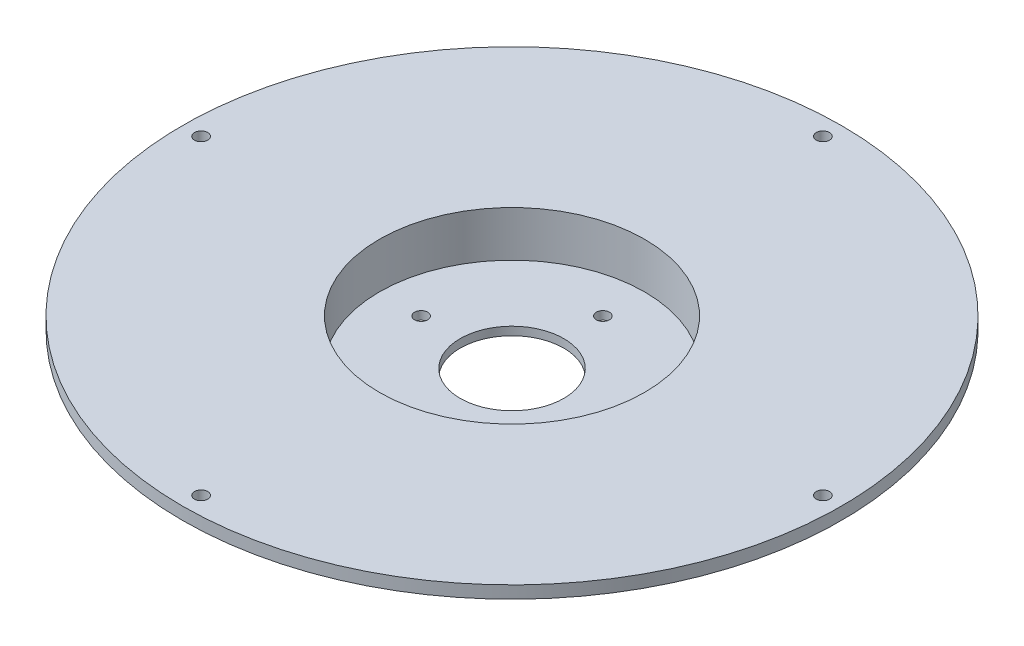
ISO-10303-21;
HEADER;
FILE_DESCRIPTION(('STEP AP214'),'2;1');
FILE_NAME('part.step','',(''),(''),'','','');
FILE_SCHEMA(('AUTOMOTIVE_DESIGN { 1 0 10303 214 1 1 1 1 }'));
ENDSEC;
DATA;
#1=APPLICATION_CONTEXT('core data for automotive mechanical design processes');
#2=APPLICATION_PROTOCOL_DEFINITION('international standard','automotive_design',2000,#1);
#3=PRODUCT_CONTEXT('',#1,'mechanical');
#4=PRODUCT('Part','Part','',(#3));
#5=PRODUCT_RELATED_PRODUCT_CATEGORY('part','',(#4));
#6=PRODUCT_DEFINITION_FORMATION('','',#4);
#7=PRODUCT_DEFINITION_CONTEXT('part definition',#1,'design');
#8=PRODUCT_DEFINITION('design','',#6,#7);
#9=PRODUCT_DEFINITION_SHAPE('','',#8);
#10=(LENGTH_UNIT() NAMED_UNIT(*) SI_UNIT(.MILLI.,.METRE.));
#11=(NAMED_UNIT(*) PLANE_ANGLE_UNIT() SI_UNIT($,.RADIAN.));
#12=(NAMED_UNIT(*) SI_UNIT($,.STERADIAN.) SOLID_ANGLE_UNIT());
#13=UNCERTAINTY_MEASURE_WITH_UNIT(LENGTH_MEASURE(1.E-05),#10,'distance_accuracy_value','');
#14=(GEOMETRIC_REPRESENTATION_CONTEXT(3) GLOBAL_UNCERTAINTY_ASSIGNED_CONTEXT((#13)) GLOBAL_UNIT_ASSIGNED_CONTEXT((#10,
#11,#12)) REPRESENTATION_CONTEXT('',''));
#15=CARTESIAN_POINT('',(0.,0.,0.));
#16=DIRECTION('',(0.,0.,1.));
#17=DIRECTION('',(1.,0.,0.));
#18=AXIS2_PLACEMENT_3D('',#15,#16,#17);
#19=CARTESIAN_POINT('',(21.92,3.,0.));
#20=DIRECTION('',(0.,-1.,0.));
#21=DIRECTION('',(0.,0.,-1.));
#22=AXIS2_PLACEMENT_3D('',#19,#20,#21);
#23=CYLINDRICAL_SURFACE('',#22,1.6);
#24=CARTESIAN_POINT('',(21.92,-10.,0.));
#25=DIRECTION('',(0.,-1.,0.));
#26=DIRECTION('',(0.,0.,-1.));
#27=AXIS2_PLACEMENT_3D('',#24,#25,#26);
#28=CIRCLE('',#27,1.6);
#29=CARTESIAN_POINT('',(21.92,-10.,-1.59999999999992));
#30=VERTEX_POINT('',#29);
#31=EDGE_CURVE('E87',#30,#30,#28,.T.);
#32=ORIENTED_EDGE('',*,*,#31,.T.);
#33=EDGE_LOOP('',(#32));
#34=FACE_BOUND('',#33,.T.);
#35=CARTESIAN_POINT('',(21.92,-8.,0.));
#36=DIRECTION('',(0.,1.,0.));
#37=DIRECTION('',(0.,0.,1.));
#38=AXIS2_PLACEMENT_3D('',#35,#36,#37);
#39=CIRCLE('',#38,1.6);
#40=CARTESIAN_POINT('',(21.92,-8.,1.60000000000008));
#41=VERTEX_POINT('',#40);
#42=EDGE_CURVE('E90',#41,#41,#39,.T.);
#43=ORIENTED_EDGE('',*,*,#42,.T.);
#44=EDGE_LOOP('',(#43));
#45=FACE_BOUND('',#44,.T.);
#46=ADVANCED_FACE('F34',(#34,#45),#23,.F.);
#47=CARTESIAN_POINT('',(-1.59594559789866E-13,3.,21.92));
#48=DIRECTION('',(0.,-1.,0.));
#49=DIRECTION('',(0.,0.,-1.));
#50=AXIS2_PLACEMENT_3D('',#47,#48,#49);
#51=CYLINDRICAL_SURFACE('',#50,1.6);
#52=CARTESIAN_POINT('',(-1.59594559789866E-13,-10.,21.92));
#53=DIRECTION('',(0.,-1.,0.));
#54=DIRECTION('',(0.,0.,-1.));
#55=AXIS2_PLACEMENT_3D('',#52,#53,#54);
#56=CIRCLE('',#55,1.6);
#57=CARTESIAN_POINT('',(-1.59594559789866E-13,-10.,20.32));
#58=VERTEX_POINT('',#57);
#59=EDGE_CURVE('E84',#58,#58,#56,.T.);
#60=ORIENTED_EDGE('',*,*,#59,.T.);
#61=EDGE_LOOP('',(#60));
#62=FACE_BOUND('',#61,.T.);
#63=CARTESIAN_POINT('',(-1.59594559789866E-13,-8.,21.92));
#64=DIRECTION('',(0.,1.,0.));
#65=DIRECTION('',(0.,0.,1.));
#66=AXIS2_PLACEMENT_3D('',#63,#64,#65);
#67=CIRCLE('',#66,1.6);
#68=CARTESIAN_POINT('',(-1.59594559789866E-13,-8.,23.52));
#69=VERTEX_POINT('',#68);
#70=EDGE_CURVE('E93',#69,#69,#67,.T.);
#71=ORIENTED_EDGE('',*,*,#70,.T.);
#72=EDGE_LOOP('',(#71));
#73=FACE_BOUND('',#72,.T.);
#74=ADVANCED_FACE('F169',(#62,#73),#51,.F.);
#75=CARTESIAN_POINT('',(0.,3.,-21.92));
#76=DIRECTION('',(0.,-1.,0.));
#77=DIRECTION('',(0.,0.,-1.));
#78=AXIS2_PLACEMENT_3D('',#75,#76,#77);
#79=CYLINDRICAL_SURFACE('',#78,1.6);
#80=CARTESIAN_POINT('',(0.,-10.,-21.92));
#81=DIRECTION('',(0.,-1.,0.));
#82=DIRECTION('',(0.,0.,-1.));
#83=AXIS2_PLACEMENT_3D('',#80,#81,#82);
#84=CIRCLE('',#83,1.6);
#85=CARTESIAN_POINT('',(0.,-10.,-23.52));
#86=VERTEX_POINT('',#85);
#87=EDGE_CURVE('E81',#86,#86,#84,.T.);
#88=ORIENTED_EDGE('',*,*,#87,.T.);
#89=EDGE_LOOP('',(#88));
#90=FACE_BOUND('',#89,.T.);
#91=CARTESIAN_POINT('',(0.,-8.,-21.92));
#92=DIRECTION('',(0.,1.,0.));
#93=DIRECTION('',(0.,0.,1.));
#94=AXIS2_PLACEMENT_3D('',#91,#92,#93);
#95=CIRCLE('',#94,1.6);
#96=CARTESIAN_POINT('',(0.,-8.,-20.32));
#97=VERTEX_POINT('',#96);
#98=EDGE_CURVE('E96',#97,#97,#95,.T.);
#99=ORIENTED_EDGE('',*,*,#98,.T.);
#100=EDGE_LOOP('',(#99));
#101=FACE_BOUND('',#100,.T.);
#102=ADVANCED_FACE('F175',(#90,#101),#79,.F.);
#103=CARTESIAN_POINT('',(-21.92,3.,-2.36139233167343E-13));
#104=DIRECTION('',(0.,-1.,0.));
#105=DIRECTION('',(0.,0.,-1.));
#106=AXIS2_PLACEMENT_3D('',#103,#104,#105);
#107=CYLINDRICAL_SURFACE('',#106,1.6);
#108=CARTESIAN_POINT('',(-21.92,-10.,-2.36139233167343E-13));
#109=DIRECTION('',(0.,-1.,0.));
#110=DIRECTION('',(0.,0.,-1.));
#111=AXIS2_PLACEMENT_3D('',#108,#109,#110);
#112=CIRCLE('',#111,1.6);
#113=CARTESIAN_POINT('',(-21.92,-10.,-1.60000000000024));
#114=VERTEX_POINT('',#113);
#115=EDGE_CURVE('E78',#114,#114,#112,.T.);
#116=ORIENTED_EDGE('',*,*,#115,.T.);
#117=EDGE_LOOP('',(#116));
#118=FACE_BOUND('',#117,.T.);
#119=CARTESIAN_POINT('',(-21.92,-8.,-2.36139233167343E-13));
#120=DIRECTION('',(0.,1.,0.));
#121=DIRECTION('',(0.,0.,1.));
#122=AXIS2_PLACEMENT_3D('',#119,#120,#121);
#123=CIRCLE('',#122,1.6);
#124=CARTESIAN_POINT('',(-21.92,-8.,1.59999999999977));
#125=VERTEX_POINT('',#124);
#126=EDGE_CURVE('E38',#125,#125,#123,.T.);
#127=ORIENTED_EDGE('',*,*,#126,.T.);
#128=EDGE_LOOP('',(#127));
#129=FACE_BOUND('',#128,.T.);
#130=ADVANCED_FACE('F36',(#118,#129),#107,.F.);
#131=CARTESIAN_POINT('',(75.,3.,-2.10023889579419E-12));
#132=DIRECTION('',(0.,-1.,0.));
#133=DIRECTION('',(0.,0.,-1.));
#134=AXIS2_PLACEMENT_3D('',#131,#132,#133);
#135=CYLINDRICAL_SURFACE('',#134,1.60000000000226);
#136=CARTESIAN_POINT('',(75.,3.,-2.10023889579419E-12));
#137=DIRECTION('',(0.,1.,0.));
#138=DIRECTION('',(0.,0.,1.));
#139=AXIS2_PLACEMENT_3D('',#136,#137,#138);
#140=CIRCLE('',#139,1.60000000000226);
#141=CARTESIAN_POINT('',(75.,3.,1.60000000000016));
#142=VERTEX_POINT('',#141);
#143=EDGE_CURVE('E46',#142,#142,#140,.T.);
#144=ORIENTED_EDGE('',*,*,#143,.T.);
#145=EDGE_LOOP('',(#144));
#146=FACE_BOUND('',#145,.T.);
#147=CARTESIAN_POINT('',(75.,0.,-2.10023889579419E-12));
#148=DIRECTION('',(0.,1.,0.));
#149=DIRECTION('',(0.,0.,1.));
#150=AXIS2_PLACEMENT_3D('',#147,#148,#149);
#151=CIRCLE('',#150,1.60000000000226);
#152=CARTESIAN_POINT('',(75.,0.,1.60000000000016));
#153=VERTEX_POINT('',#152);
#154=EDGE_CURVE('E53',#153,#153,#151,.T.);
#155=ORIENTED_EDGE('',*,*,#154,.F.);
#156=EDGE_LOOP('',(#155));
#157=FACE_BOUND('',#156,.T.);
#158=ADVANCED_FACE('F194',(#146,#157),#135,.F.);
#159=CARTESIAN_POINT('',(2.13248638558919E-12,3.,74.9999999999979));
#160=DIRECTION('',(0.,-1.,0.));
#161=DIRECTION('',(0.,0.,-1.));
#162=AXIS2_PLACEMENT_3D('',#159,#160,#161);
#163=CYLINDRICAL_SURFACE('',#162,1.60000000000316);
#164=CARTESIAN_POINT('',(2.13248638558919E-12,3.,74.9999999999979));
#165=DIRECTION('',(0.,1.,0.));
#166=DIRECTION('',(0.,0.,1.));
#167=AXIS2_PLACEMENT_3D('',#164,#165,#166);
#168=CIRCLE('',#167,1.60000000000316);
#169=CARTESIAN_POINT('',(2.13248638558919E-12,3.,76.600000000001));
#170=VERTEX_POINT('',#169);
#171=EDGE_CURVE('E68',#170,#170,#168,.T.);
#172=ORIENTED_EDGE('',*,*,#171,.T.);
#173=EDGE_LOOP('',(#172));
#174=FACE_BOUND('',#173,.T.);
#175=CARTESIAN_POINT('',(2.13248638558919E-12,0.,74.9999999999979));
#176=DIRECTION('',(0.,1.,0.));
#177=DIRECTION('',(0.,0.,1.));
#178=AXIS2_PLACEMENT_3D('',#175,#176,#177);
#179=CIRCLE('',#178,1.60000000000316);
#180=CARTESIAN_POINT('',(2.13248638558919E-12,0.,76.600000000001));
#181=VERTEX_POINT('',#180);
#182=EDGE_CURVE('E56',#181,#181,#179,.T.);
#183=ORIENTED_EDGE('',*,*,#182,.F.);
#184=EDGE_LOOP('',(#183));
#185=FACE_BOUND('',#184,.T.);
#186=ADVANCED_FACE('F180',(#174,#185),#163,.F.);
#187=CARTESIAN_POINT('',(-74.9999999999979,3.,0.));
#188=DIRECTION('',(0.,-1.,0.));
#189=DIRECTION('',(0.,0.,-1.));
#190=AXIS2_PLACEMENT_3D('',#187,#188,#189);
#191=CYLINDRICAL_SURFACE('',#190,1.60000000000137);
#192=CARTESIAN_POINT('',(-74.9999999999979,3.,0.));
#193=DIRECTION('',(0.,1.,0.));
#194=DIRECTION('',(0.,0.,1.));
#195=AXIS2_PLACEMENT_3D('',#192,#193,#194);
#196=CIRCLE('',#195,1.60000000000137);
#197=CARTESIAN_POINT('',(-74.9999999999979,3.,1.60000000000137));
#198=VERTEX_POINT('',#197);
#199=EDGE_CURVE('E71',#198,#198,#196,.T.);
#200=ORIENTED_EDGE('',*,*,#199,.T.);
#201=EDGE_LOOP('',(#200));
#202=FACE_BOUND('',#201,.T.);
#203=CARTESIAN_POINT('',(-74.9999999999979,0.,0.));
#204=DIRECTION('',(0.,1.,0.));
#205=DIRECTION('',(0.,0.,1.));
#206=AXIS2_PLACEMENT_3D('',#203,#204,#205);
#207=CIRCLE('',#206,1.60000000000137);
#208=CARTESIAN_POINT('',(-74.9999999999979,0.,1.60000000000137));
#209=VERTEX_POINT('',#208);
#210=EDGE_CURVE('E59',#209,#209,#207,.T.);
#211=ORIENTED_EDGE('',*,*,#210,.F.);
#212=EDGE_LOOP('',(#211));
#213=FACE_BOUND('',#212,.T.);
#214=ADVANCED_FACE('F183',(#202,#213),#191,.F.);
#215=CARTESIAN_POINT('',(0.,3.,-75.));
#216=DIRECTION('',(0.,-1.,0.));
#217=DIRECTION('',(0.,0.,-1.));
#218=AXIS2_PLACEMENT_3D('',#215,#216,#217);
#219=CYLINDRICAL_SURFACE('',#218,1.6);
#220=CARTESIAN_POINT('',(0.,3.,-75.));
#221=DIRECTION('',(0.,1.,0.));
#222=DIRECTION('',(0.,0.,1.));
#223=AXIS2_PLACEMENT_3D('',#220,#221,#222);
#224=CIRCLE('',#223,1.6);
#225=CARTESIAN_POINT('',(0.,3.,-73.4));
#226=VERTEX_POINT('',#225);
#227=EDGE_CURVE('E52',#226,#226,#224,.T.);
#228=ORIENTED_EDGE('',*,*,#227,.T.);
#229=EDGE_LOOP('',(#228));
#230=FACE_BOUND('',#229,.T.);
#231=CARTESIAN_POINT('',(0.,0.,-75.));
#232=DIRECTION('',(0.,1.,0.));
#233=DIRECTION('',(0.,0.,1.));
#234=AXIS2_PLACEMENT_3D('',#231,#232,#233);
#235=CIRCLE('',#234,1.6);
#236=CARTESIAN_POINT('',(0.,0.,-73.4));
#237=VERTEX_POINT('',#236);
#238=EDGE_CURVE('E62',#237,#237,#235,.T.);
#239=ORIENTED_EDGE('',*,*,#238,.F.);
#240=EDGE_LOOP('',(#239));
#241=FACE_BOUND('',#240,.T.);
#242=ADVANCED_FACE('F154',(#230,#241),#219,.F.);
#243=CARTESIAN_POINT('',(0.,3.,0.));
#244=DIRECTION('',(0.,-1.,0.));
#245=DIRECTION('',(0.,0.,-1.));
#246=AXIS2_PLACEMENT_3D('',#243,#244,#245);
#247=CYLINDRICAL_SURFACE('',#246,79.5);
#248=CARTESIAN_POINT('',(0.,3.,0.));
#249=DIRECTION('',(0.,1.,0.));
#250=DIRECTION('',(0.,0.,1.));
#251=AXIS2_PLACEMENT_3D('',#248,#249,#250);
#252=CIRCLE('',#251,79.5);
#253=CARTESIAN_POINT('',(0.,3.,79.5));
#254=VERTEX_POINT('',#253);
#255=EDGE_CURVE('E42',#254,#254,#252,.T.);
#256=ORIENTED_EDGE('',*,*,#255,.F.);
#257=EDGE_LOOP('',(#256));
#258=FACE_BOUND('',#257,.T.);
#259=CARTESIAN_POINT('',(0.,0.,0.));
#260=DIRECTION('',(0.,1.,0.));
#261=DIRECTION('',(0.,0.,1.));
#262=AXIS2_PLACEMENT_3D('',#259,#260,#261);
#263=CIRCLE('',#262,79.5);
#264=CARTESIAN_POINT('',(0.,0.,79.5));
#265=VERTEX_POINT('',#264);
#266=EDGE_CURVE('E49',#265,#265,#263,.T.);
#267=ORIENTED_EDGE('',*,*,#266,.T.);
#268=EDGE_LOOP('',(#267));
#269=FACE_BOUND('',#268,.T.);
#270=ADVANCED_FACE('F140',(#258,#269),#247,.T.);
#271=CARTESIAN_POINT('',(0.,3.,0.));
#272=DIRECTION('',(0.,1.,0.));
#273=DIRECTION('',(0.,0.,1.));
#274=AXIS2_PLACEMENT_3D('',#271,#272,#273);
#275=PLANE('',#274);
#276=CARTESIAN_POINT('',(0.,3.,0.));
#277=DIRECTION('',(0.,1.,0.));
#278=DIRECTION('',(0.,0.,1.));
#279=AXIS2_PLACEMENT_3D('',#276,#277,#278);
#280=CIRCLE('',#279,32.);
#281=CARTESIAN_POINT('',(0.,3.,32.));
#282=VERTEX_POINT('',#281);
#283=EDGE_CURVE('E99',#282,#282,#280,.T.);
#284=ORIENTED_EDGE('',*,*,#283,.F.);
#285=EDGE_LOOP('',(#284));
#286=FACE_BOUND('',#285,.T.);
#287=ORIENTED_EDGE('',*,*,#227,.F.);
#288=EDGE_LOOP('',(#287));
#289=FACE_BOUND('',#288,.T.);
#290=ORIENTED_EDGE('',*,*,#199,.F.);
#291=EDGE_LOOP('',(#290));
#292=FACE_BOUND('',#291,.T.);
#293=ORIENTED_EDGE('',*,*,#171,.F.);
#294=EDGE_LOOP('',(#293));
#295=FACE_BOUND('',#294,.T.);
#296=ORIENTED_EDGE('',*,*,#143,.F.);
#297=EDGE_LOOP('',(#296));
#298=FACE_BOUND('',#297,.T.);
#299=ORIENTED_EDGE('',*,*,#255,.T.);
#300=EDGE_LOOP('',(#299));
#301=FACE_BOUND('',#300,.T.);
#302=ADVANCED_FACE('F136',(#286,#289,#292,#295,#298,#301),#275,.T.);
#303=CARTESIAN_POINT('',(0.,0.,0.));
#304=DIRECTION('',(0.,1.,0.));
#305=DIRECTION('',(0.,0.,1.));
#306=AXIS2_PLACEMENT_3D('',#303,#304,#305);
#307=PLANE('',#306);
#308=CARTESIAN_POINT('',(0.,0.,0.));
#309=DIRECTION('',(0.,1.,0.));
#310=DIRECTION('',(0.,0.,1.));
#311=AXIS2_PLACEMENT_3D('',#308,#309,#310);
#312=CIRCLE('',#311,34.);
#313=CARTESIAN_POINT('',(0.,0.,34.));
#314=VERTEX_POINT('',#313);
#315=EDGE_CURVE('E10',#314,#314,#312,.F.);
#316=ORIENTED_EDGE('',*,*,#315,.F.);
#317=EDGE_LOOP('',(#316));
#318=FACE_BOUND('',#317,.T.);
#319=ORIENTED_EDGE('',*,*,#238,.T.);
#320=EDGE_LOOP('',(#319));
#321=FACE_BOUND('',#320,.T.);
#322=ORIENTED_EDGE('',*,*,#210,.T.);
#323=EDGE_LOOP('',(#322));
#324=FACE_BOUND('',#323,.T.);
#325=ORIENTED_EDGE('',*,*,#182,.T.);
#326=EDGE_LOOP('',(#325));
#327=FACE_BOUND('',#326,.T.);
#328=ORIENTED_EDGE('',*,*,#154,.T.);
#329=EDGE_LOOP('',(#328));
#330=FACE_BOUND('',#329,.T.);
#331=ORIENTED_EDGE('',*,*,#266,.F.);
#332=EDGE_LOOP('',(#331));
#333=FACE_BOUND('',#332,.T.);
#334=ADVANCED_FACE('F139',(#318,#321,#324,#327,#330,#333),#307,.F.);
#335=CARTESIAN_POINT('',(0.,-10.,0.));
#336=DIRECTION('',(0.,-1.,0.));
#337=DIRECTION('',(0.,0.,-1.));
#338=AXIS2_PLACEMENT_3D('',#335,#336,#337);
#339=PLANE('',#338);
#340=CARTESIAN_POINT('',(0.,-10.,0.));
#341=DIRECTION('',(0.,-1.,0.));
#342=DIRECTION('',(0.,0.,-1.));
#343=AXIS2_PLACEMENT_3D('',#340,#341,#342);
#344=CIRCLE('',#343,12.5);
#345=CARTESIAN_POINT('',(0.,-10.,-12.5));
#346=VERTEX_POINT('',#345);
#347=EDGE_CURVE('E103',#346,#346,#344,.T.);
#348=ORIENTED_EDGE('',*,*,#347,.F.);
#349=EDGE_LOOP('',(#348));
#350=FACE_BOUND('',#349,.T.);
#351=ORIENTED_EDGE('',*,*,#87,.F.);
#352=EDGE_LOOP('',(#351));
#353=FACE_BOUND('',#352,.T.);
#354=ORIENTED_EDGE('',*,*,#31,.F.);
#355=EDGE_LOOP('',(#354));
#356=FACE_BOUND('',#355,.T.);
#357=ORIENTED_EDGE('',*,*,#59,.F.);
#358=EDGE_LOOP('',(#357));
#359=FACE_BOUND('',#358,.T.);
#360=ORIENTED_EDGE('',*,*,#115,.F.);
#361=EDGE_LOOP('',(#360));
#362=FACE_BOUND('',#361,.T.);
#363=CARTESIAN_POINT('',(0.,-10.,0.));
#364=DIRECTION('',(0.,-1.,0.));
#365=DIRECTION('',(0.,0.,-1.));
#366=AXIS2_PLACEMENT_3D('',#363,#364,#365);
#367=CIRCLE('',#366,34.);
#368=CARTESIAN_POINT('',(0.,-10.,-34.));
#369=VERTEX_POINT('',#368);
#370=EDGE_CURVE('E64',#369,#369,#367,.T.);
#371=ORIENTED_EDGE('',*,*,#370,.T.);
#372=EDGE_LOOP('',(#371));
#373=FACE_BOUND('',#372,.T.);
#374=ADVANCED_FACE('F159',(#350,#353,#356,#359,#362,#373),#339,.T.);
#375=CARTESIAN_POINT('',(0.,-10.,0.));
#376=DIRECTION('',(0.,1.,0.));
#377=DIRECTION('',(0.,0.,1.));
#378=AXIS2_PLACEMENT_3D('',#375,#376,#377);
#379=CYLINDRICAL_SURFACE('',#378,34.);
#380=ORIENTED_EDGE('',*,*,#370,.F.);
#381=EDGE_LOOP('',(#380));
#382=FACE_BOUND('',#381,.T.);
#383=ORIENTED_EDGE('',*,*,#315,.T.);
#384=EDGE_LOOP('',(#383));
#385=FACE_BOUND('',#384,.T.);
#386=ADVANCED_FACE('F132',(#382,#385),#379,.T.);
#387=CARTESIAN_POINT('',(0.,-8.,0.));
#388=DIRECTION('',(0.,1.,0.));
#389=DIRECTION('',(0.,0.,1.));
#390=AXIS2_PLACEMENT_3D('',#387,#388,#389);
#391=CYLINDRICAL_SURFACE('',#390,32.);
#392=CARTESIAN_POINT('',(0.,-8.,0.));
#393=DIRECTION('',(0.,1.,0.));
#394=DIRECTION('',(0.,0.,1.));
#395=AXIS2_PLACEMENT_3D('',#392,#393,#394);
#396=CIRCLE('',#395,32.);
#397=CARTESIAN_POINT('',(0.,-8.,32.));
#398=VERTEX_POINT('',#397);
#399=EDGE_CURVE('E102',#398,#398,#396,.T.);
#400=ORIENTED_EDGE('',*,*,#399,.F.);
#401=EDGE_LOOP('',(#400));
#402=FACE_BOUND('',#401,.T.);
#403=ORIENTED_EDGE('',*,*,#283,.T.);
#404=EDGE_LOOP('',(#403));
#405=FACE_BOUND('',#404,.T.);
#406=ADVANCED_FACE('F117',(#402,#405),#391,.F.);
#407=CARTESIAN_POINT('',(0.,-8.,0.));
#408=DIRECTION('',(0.,1.,0.));
#409=DIRECTION('',(0.,0.,1.));
#410=AXIS2_PLACEMENT_3D('',#407,#408,#409);
#411=PLANE('',#410);
#412=CARTESIAN_POINT('',(0.,-8.,0.));
#413=DIRECTION('',(0.,1.,0.));
#414=DIRECTION('',(0.,0.,1.));
#415=AXIS2_PLACEMENT_3D('',#412,#413,#414);
#416=CIRCLE('',#415,12.5);
#417=CARTESIAN_POINT('',(0.,-8.,12.5));
#418=VERTEX_POINT('',#417);
#419=EDGE_CURVE('E108',#418,#418,#416,.T.);
#420=ORIENTED_EDGE('',*,*,#419,.F.);
#421=EDGE_LOOP('',(#420));
#422=FACE_BOUND('',#421,.T.);
#423=ORIENTED_EDGE('',*,*,#42,.F.);
#424=EDGE_LOOP('',(#423));
#425=FACE_BOUND('',#424,.T.);
#426=ORIENTED_EDGE('',*,*,#70,.F.);
#427=EDGE_LOOP('',(#426));
#428=FACE_BOUND('',#427,.T.);
#429=ORIENTED_EDGE('',*,*,#98,.F.);
#430=EDGE_LOOP('',(#429));
#431=FACE_BOUND('',#430,.T.);
#432=ORIENTED_EDGE('',*,*,#126,.F.);
#433=EDGE_LOOP('',(#432));
#434=FACE_BOUND('',#433,.T.);
#435=ORIENTED_EDGE('',*,*,#399,.T.);
#436=EDGE_LOOP('',(#435));
#437=FACE_BOUND('',#436,.T.);
#438=ADVANCED_FACE('F114',(#422,#425,#428,#431,#434,#437),#411,.T.);
#439=CARTESIAN_POINT('',(0.,-20.,0.));
#440=DIRECTION('',(0.,1.,0.));
#441=DIRECTION('',(0.,0.,1.));
#442=AXIS2_PLACEMENT_3D('',#439,#440,#441);
#443=CYLINDRICAL_SURFACE('',#442,12.5);
#444=ORIENTED_EDGE('',*,*,#347,.T.);
#445=EDGE_LOOP('',(#444));
#446=FACE_BOUND('',#445,.T.);
#447=ORIENTED_EDGE('',*,*,#419,.T.);
#448=EDGE_LOOP('',(#447));
#449=FACE_BOUND('',#448,.T.);
#450=ADVANCED_FACE('F112',(#446,#449),#443,.F.);
#451=CLOSED_SHELL('',(#46,#74,#102,#130,#158,#186,#214,#242,#270,#302,#334,#374,#386,#406,#438,#450));
#452=MANIFOLD_SOLID_BREP('B2',#451);
#453=ADVANCED_BREP_SHAPE_REPRESENTATION('',(#18,#452),#14);
#454=SHAPE_DEFINITION_REPRESENTATION(#9,#453);
ENDSEC;
END-ISO-10303-21;
